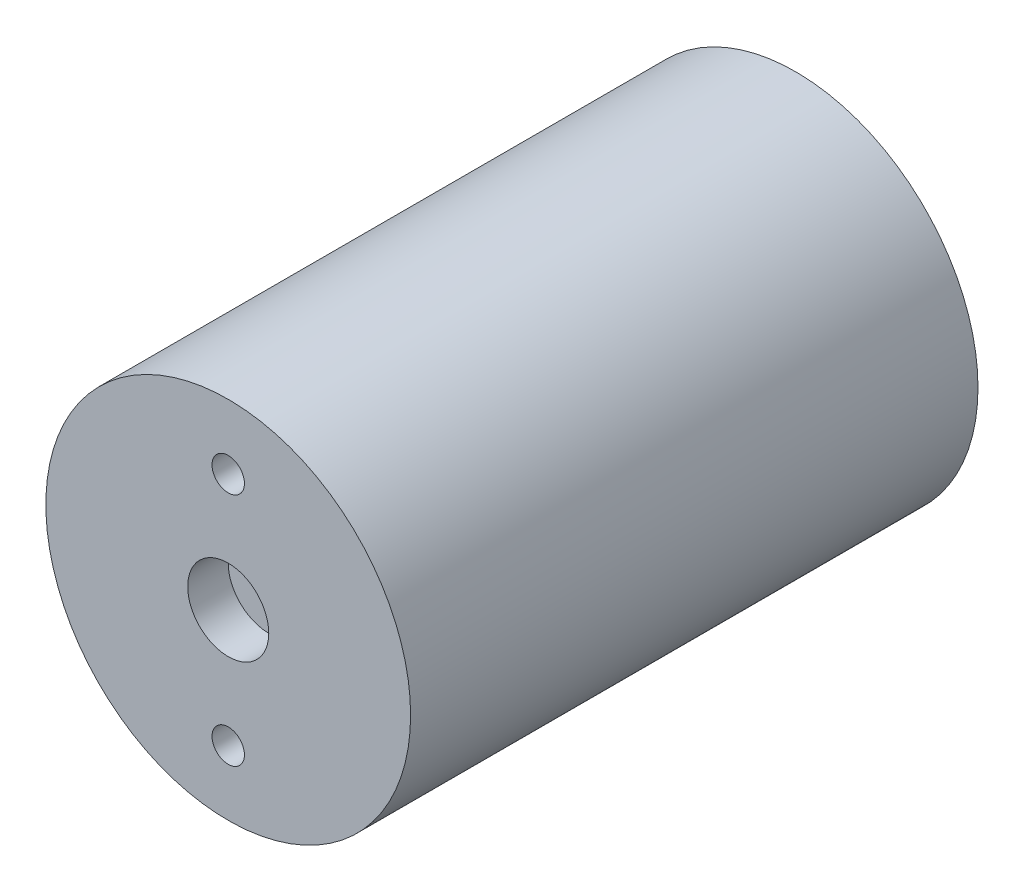
ISO-10303-21;
HEADER;
FILE_DESCRIPTION(('STEP AP214'),'2;1');
FILE_NAME('part.step','',(''),(''),'','','');
FILE_SCHEMA(('AUTOMOTIVE_DESIGN { 1 0 10303 214 1 1 1 1 }'));
ENDSEC;
DATA;
#1=APPLICATION_CONTEXT('core data for automotive mechanical design processes');
#2=APPLICATION_PROTOCOL_DEFINITION('international standard','automotive_design',2000,#1);
#3=PRODUCT_CONTEXT('',#1,'mechanical');
#4=PRODUCT('Part','Part','',(#3));
#5=PRODUCT_RELATED_PRODUCT_CATEGORY('part','',(#4));
#6=PRODUCT_DEFINITION_FORMATION('','',#4);
#7=PRODUCT_DEFINITION_CONTEXT('part definition',#1,'design');
#8=PRODUCT_DEFINITION('design','',#6,#7);
#9=PRODUCT_DEFINITION_SHAPE('','',#8);
#10=(LENGTH_UNIT() NAMED_UNIT(*) SI_UNIT(.MILLI.,.METRE.));
#11=(NAMED_UNIT(*) PLANE_ANGLE_UNIT() SI_UNIT($,.RADIAN.));
#12=(NAMED_UNIT(*) SI_UNIT($,.STERADIAN.) SOLID_ANGLE_UNIT());
#13=UNCERTAINTY_MEASURE_WITH_UNIT(LENGTH_MEASURE(1.E-05),#10,'distance_accuracy_value','');
#14=(GEOMETRIC_REPRESENTATION_CONTEXT(3) GLOBAL_UNCERTAINTY_ASSIGNED_CONTEXT((#13)) GLOBAL_UNIT_ASSIGNED_CONTEXT((#10,
#11,#12)) REPRESENTATION_CONTEXT('',''));
#15=CARTESIAN_POINT('',(0.,0.,0.));
#16=DIRECTION('',(0.,0.,1.));
#17=DIRECTION('',(1.,0.,0.));
#18=AXIS2_PLACEMENT_3D('',#15,#16,#17);
#19=CARTESIAN_POINT('',(0.,0.,70.));
#20=DIRECTION('',(0.,0.,-1.));
#21=DIRECTION('',(-1.,0.,0.));
#22=AXIS2_PLACEMENT_3D('',#19,#20,#21);
#23=CYLINDRICAL_SURFACE('',#22,22.5);
#24=CARTESIAN_POINT('',(0.,0.,70.));
#25=DIRECTION('',(0.,0.,1.));
#26=DIRECTION('',(1.,0.,0.));
#27=AXIS2_PLACEMENT_3D('',#24,#25,#26);
#28=CIRCLE('',#27,22.5);
#29=CARTESIAN_POINT('',(22.5,0.,70.));
#30=VERTEX_POINT('',#29);
#31=EDGE_CURVE('E10',#30,#30,#28,.T.);
#32=ORIENTED_EDGE('',*,*,#31,.F.);
#33=EDGE_LOOP('',(#32));
#34=FACE_BOUND('',#33,.T.);
#35=CARTESIAN_POINT('',(0.,0.,0.));
#36=DIRECTION('',(0.,0.,1.));
#37=DIRECTION('',(1.,0.,0.));
#38=AXIS2_PLACEMENT_3D('',#35,#36,#37);
#39=CIRCLE('',#38,22.5);
#40=CARTESIAN_POINT('',(22.5,0.,0.));
#41=VERTEX_POINT('',#40);
#42=EDGE_CURVE('E36',#41,#41,#39,.T.);
#43=ORIENTED_EDGE('',*,*,#42,.T.);
#44=EDGE_LOOP('',(#43));
#45=FACE_BOUND('',#44,.T.);
#46=ADVANCED_FACE('F33',(#34,#45),#23,.T.);
#47=CARTESIAN_POINT('',(0.,0.,70.));
#48=DIRECTION('',(0.,0.,1.));
#49=DIRECTION('',(1.,0.,0.));
#50=AXIS2_PLACEMENT_3D('',#47,#48,#49);
#51=PLANE('',#50);
#52=CARTESIAN_POINT('',(0.,0.,70.));
#53=DIRECTION('',(0.,0.,1.));
#54=DIRECTION('',(1.,0.,0.));
#55=AXIS2_PLACEMENT_3D('',#52,#53,#54);
#56=CIRCLE('',#55,5.);
#57=CARTESIAN_POINT('',(5.,0.,70.));
#58=VERTEX_POINT('',#57);
#59=EDGE_CURVE('E57',#58,#58,#56,.T.);
#60=ORIENTED_EDGE('',*,*,#59,.F.);
#61=EDGE_LOOP('',(#60));
#62=FACE_BOUND('',#61,.T.);
#63=CARTESIAN_POINT('',(-1.11022302462516E-13,14.5,70.));
#64=DIRECTION('',(0.,0.,1.));
#65=DIRECTION('',(1.,0.,0.));
#66=AXIS2_PLACEMENT_3D('',#63,#64,#65);
#67=CIRCLE('',#66,2.);
#68=CARTESIAN_POINT('',(1.99999999999989,14.5,70.));
#69=VERTEX_POINT('',#68);
#70=EDGE_CURVE('E52',#69,#69,#67,.T.);
#71=ORIENTED_EDGE('',*,*,#70,.F.);
#72=EDGE_LOOP('',(#71));
#73=FACE_BOUND('',#72,.T.);
#74=CARTESIAN_POINT('',(0.,-14.5,70.));
#75=DIRECTION('',(0.,0.,1.));
#76=DIRECTION('',(1.,0.,0.));
#77=AXIS2_PLACEMENT_3D('',#74,#75,#76);
#78=CIRCLE('',#77,2.);
#79=CARTESIAN_POINT('',(2.00000000000003,-14.5,70.));
#80=VERTEX_POINT('',#79);
#81=EDGE_CURVE('E45',#80,#80,#78,.T.);
#82=ORIENTED_EDGE('',*,*,#81,.F.);
#83=EDGE_LOOP('',(#82));
#84=FACE_BOUND('',#83,.T.);
#85=ORIENTED_EDGE('',*,*,#31,.T.);
#86=EDGE_LOOP('',(#85));
#87=FACE_BOUND('',#86,.T.);
#88=ADVANCED_FACE('F72',(#62,#73,#84,#87),#51,.T.);
#89=CARTESIAN_POINT('',(0.,0.,0.));
#90=DIRECTION('',(0.,0.,1.));
#91=DIRECTION('',(1.,0.,0.));
#92=AXIS2_PLACEMENT_3D('',#89,#90,#91);
#93=PLANE('',#92);
#94=ORIENTED_EDGE('',*,*,#42,.F.);
#95=EDGE_LOOP('',(#94));
#96=FACE_BOUND('',#95,.T.);
#97=ADVANCED_FACE('F75',(#96),#93,.F.);
#98=CARTESIAN_POINT('',(0.,-14.5,60.));
#99=DIRECTION('',(0.,0.,1.));
#100=DIRECTION('',(1.,0.,0.));
#101=AXIS2_PLACEMENT_3D('',#98,#99,#100);
#102=CYLINDRICAL_SURFACE('',#101,2.);
#103=CARTESIAN_POINT('',(0.,-14.5,60.));
#104=DIRECTION('',(0.,0.,1.));
#105=DIRECTION('',(1.,0.,0.));
#106=AXIS2_PLACEMENT_3D('',#103,#104,#105);
#107=CIRCLE('',#106,2.);
#108=CARTESIAN_POINT('',(2.00000000000003,-14.5,60.));
#109=VERTEX_POINT('',#108);
#110=EDGE_CURVE('E48',#109,#109,#107,.T.);
#111=ORIENTED_EDGE('',*,*,#110,.F.);
#112=EDGE_LOOP('',(#111));
#113=FACE_BOUND('',#112,.T.);
#114=ORIENTED_EDGE('',*,*,#81,.T.);
#115=EDGE_LOOP('',(#114));
#116=FACE_BOUND('',#115,.T.);
#117=ADVANCED_FACE('F81',(#113,#116),#102,.F.);
#118=CARTESIAN_POINT('',(0.,-14.5,60.));
#119=DIRECTION('',(0.,0.,1.));
#120=DIRECTION('',(1.,0.,0.));
#121=AXIS2_PLACEMENT_3D('',#118,#119,#120);
#122=PLANE('',#121);
#123=ORIENTED_EDGE('',*,*,#110,.T.);
#124=EDGE_LOOP('',(#123));
#125=FACE_BOUND('',#124,.T.);
#126=ADVANCED_FACE('F83',(#125),#122,.T.);
#127=CARTESIAN_POINT('',(-1.11022302462516E-13,14.5,60.));
#128=DIRECTION('',(0.,0.,1.));
#129=DIRECTION('',(1.,0.,0.));
#130=AXIS2_PLACEMENT_3D('',#127,#128,#129);
#131=CYLINDRICAL_SURFACE('',#130,2.);
#132=CARTESIAN_POINT('',(-1.11022302462516E-13,14.5,60.));
#133=DIRECTION('',(0.,0.,1.));
#134=DIRECTION('',(1.,0.,0.));
#135=AXIS2_PLACEMENT_3D('',#132,#133,#134);
#136=CIRCLE('',#135,2.);
#137=CARTESIAN_POINT('',(1.99999999999989,14.5,60.));
#138=VERTEX_POINT('',#137);
#139=EDGE_CURVE('E43',#138,#138,#136,.T.);
#140=ORIENTED_EDGE('',*,*,#139,.F.);
#141=EDGE_LOOP('',(#140));
#142=FACE_BOUND('',#141,.T.);
#143=ORIENTED_EDGE('',*,*,#70,.T.);
#144=EDGE_LOOP('',(#143));
#145=FACE_BOUND('',#144,.T.);
#146=ADVANCED_FACE('F90',(#142,#145),#131,.F.);
#147=CARTESIAN_POINT('',(-1.11022302462516E-13,14.5,60.));
#148=DIRECTION('',(0.,0.,1.));
#149=DIRECTION('',(1.,0.,0.));
#150=AXIS2_PLACEMENT_3D('',#147,#148,#149);
#151=PLANE('',#150);
#152=ORIENTED_EDGE('',*,*,#139,.T.);
#153=EDGE_LOOP('',(#152));
#154=FACE_BOUND('',#153,.T.);
#155=ADVANCED_FACE('F68',(#154),#151,.T.);
#156=CARTESIAN_POINT('',(0.,0.,65.));
#157=DIRECTION('',(0.,0.,1.));
#158=DIRECTION('',(1.,0.,0.));
#159=AXIS2_PLACEMENT_3D('',#156,#157,#158);
#160=CYLINDRICAL_SURFACE('',#159,5.);
#161=CARTESIAN_POINT('',(0.,0.,65.));
#162=DIRECTION('',(0.,0.,1.));
#163=DIRECTION('',(1.,0.,0.));
#164=AXIS2_PLACEMENT_3D('',#161,#162,#163);
#165=CIRCLE('',#164,5.);
#166=CARTESIAN_POINT('',(5.,0.,65.));
#167=VERTEX_POINT('',#166);
#168=EDGE_CURVE('E49',#167,#167,#165,.T.);
#169=ORIENTED_EDGE('',*,*,#168,.F.);
#170=EDGE_LOOP('',(#169));
#171=FACE_BOUND('',#170,.T.);
#172=ORIENTED_EDGE('',*,*,#59,.T.);
#173=EDGE_LOOP('',(#172));
#174=FACE_BOUND('',#173,.T.);
#175=ADVANCED_FACE('F65',(#171,#174),#160,.F.);
#176=CARTESIAN_POINT('',(0.,0.,65.));
#177=DIRECTION('',(0.,0.,1.));
#178=DIRECTION('',(1.,0.,0.));
#179=AXIS2_PLACEMENT_3D('',#176,#177,#178);
#180=PLANE('',#179);
#181=ORIENTED_EDGE('',*,*,#168,.T.);
#182=EDGE_LOOP('',(#181));
#183=FACE_BOUND('',#182,.T.);
#184=ADVANCED_FACE('F63',(#183),#180,.T.);
#185=CLOSED_SHELL('',(#46,#88,#97,#117,#126,#146,#155,#175,#184));
#186=MANIFOLD_SOLID_BREP('B2',#185);
#187=ADVANCED_BREP_SHAPE_REPRESENTATION('',(#18,#186),#14);
#188=SHAPE_DEFINITION_REPRESENTATION(#9,#187);
ENDSEC;
END-ISO-10303-21;
